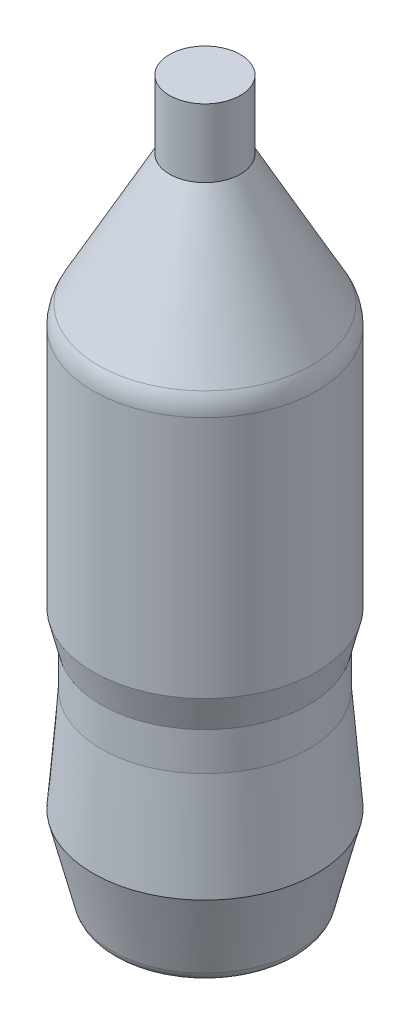
ISO-10303-21;
HEADER;
FILE_DESCRIPTION(('STEP AP214'),'2;1');
FILE_NAME('part.step','',(''),(''),'','','');
FILE_SCHEMA(('AUTOMOTIVE_DESIGN { 1 0 10303 214 1 1 1 1 }'));
ENDSEC;
DATA;
#1=APPLICATION_CONTEXT('core data for automotive mechanical design processes');
#2=APPLICATION_PROTOCOL_DEFINITION('international standard','automotive_design',2000,#1);
#3=PRODUCT_CONTEXT('',#1,'mechanical');
#4=PRODUCT('Part','Part','',(#3));
#5=PRODUCT_RELATED_PRODUCT_CATEGORY('part','',(#4));
#6=PRODUCT_DEFINITION_FORMATION('','',#4);
#7=PRODUCT_DEFINITION_CONTEXT('part definition',#1,'design');
#8=PRODUCT_DEFINITION('design','',#6,#7);
#9=PRODUCT_DEFINITION_SHAPE('','',#8);
#10=(LENGTH_UNIT() NAMED_UNIT(*) SI_UNIT(.MILLI.,.METRE.));
#11=(NAMED_UNIT(*) PLANE_ANGLE_UNIT() SI_UNIT($,.RADIAN.));
#12=(NAMED_UNIT(*) SI_UNIT($,.STERADIAN.) SOLID_ANGLE_UNIT());
#13=UNCERTAINTY_MEASURE_WITH_UNIT(LENGTH_MEASURE(1.E-05),#10,'distance_accuracy_value','');
#14=(GEOMETRIC_REPRESENTATION_CONTEXT(3) GLOBAL_UNCERTAINTY_ASSIGNED_CONTEXT((#13)) GLOBAL_UNIT_ASSIGNED_CONTEXT((#10,
#11,#12)) REPRESENTATION_CONTEXT('',''));
#15=CARTESIAN_POINT('',(0.,0.,0.));
#16=DIRECTION('',(0.,0.,1.));
#17=DIRECTION('',(1.,0.,0.));
#18=AXIS2_PLACEMENT_3D('',#15,#16,#17);
#19=CARTESIAN_POINT('',(0.,265.,0.));
#20=DIRECTION('',(0.,-1.,0.));
#21=DIRECTION('',(0.,0.,-1.));
#22=AXIS2_PLACEMENT_3D('',#19,#20,#21);
#23=CYLINDRICAL_SURFACE('',#22,41.);
#24=CARTESIAN_POINT('',(0.,185.153168126167,0.));
#25=DIRECTION('',(0.,1.,0.));
#26=DIRECTION('',(0.,0.,1.));
#27=AXIS2_PLACEMENT_3D('',#24,#25,#26);
#28=CIRCLE('',#27,41.);
#29=CARTESIAN_POINT('',(0.,185.153168126167,41.));
#30=VERTEX_POINT('',#29);
#31=EDGE_CURVE('E53',#30,#30,#28,.F.);
#32=ORIENTED_EDGE('',*,*,#31,.T.);
#33=EDGE_LOOP('',(#32));
#34=FACE_BOUND('',#33,.T.);
#35=CARTESIAN_POINT('',(0.,96.,0.));
#36=DIRECTION('',(0.,-1.,0.));
#37=DIRECTION('',(0.,0.,-1.));
#38=AXIS2_PLACEMENT_3D('',#35,#36,#37);
#39=CIRCLE('',#38,41.);
#40=CARTESIAN_POINT('',(0.,96.,41.));
#41=VERTEX_POINT('',#40);
#42=EDGE_CURVE('E78',#41,#41,#39,.T.);
#43=ORIENTED_EDGE('',*,*,#42,.F.);
#44=EDGE_LOOP('',(#43));
#45=FACE_BOUND('',#44,.T.);
#46=ADVANCED_FACE('F45',(#34,#45),#23,.T.);
#47=CARTESIAN_POINT('',(0.,240.,0.));
#48=DIRECTION('',(0.,1.,0.));
#49=DIRECTION('',(0.,0.,1.));
#50=AXIS2_PLACEMENT_3D('',#47,#48,#49);
#51=CYLINDRICAL_SURFACE('',#50,13.);
#52=CARTESIAN_POINT('',(0.,240.,0.));
#53=DIRECTION('',(0.,1.,0.));
#54=DIRECTION('',(0.,0.,1.));
#55=AXIS2_PLACEMENT_3D('',#52,#53,#54);
#56=CIRCLE('',#55,13.);
#57=CARTESIAN_POINT('',(0.,240.,-13.));
#58=VERTEX_POINT('',#57);
#59=EDGE_CURVE('E77',#58,#58,#56,.T.);
#60=ORIENTED_EDGE('',*,*,#59,.T.);
#61=EDGE_LOOP('',(#60));
#62=FACE_BOUND('',#61,.T.);
#63=CARTESIAN_POINT('',(0.,265.,0.));
#64=DIRECTION('',(0.,1.,0.));
#65=DIRECTION('',(0.,0.,1.));
#66=AXIS2_PLACEMENT_3D('',#63,#64,#65);
#67=CIRCLE('',#66,13.);
#68=CARTESIAN_POINT('',(0.,265.,13.));
#69=VERTEX_POINT('',#68);
#70=EDGE_CURVE('E82',#69,#69,#67,.T.);
#71=ORIENTED_EDGE('',*,*,#70,.F.);
#72=EDGE_LOOP('',(#71));
#73=FACE_BOUND('',#72,.T.);
#74=ADVANCED_FACE('F94',(#62,#73),#51,.T.);
#75=CARTESIAN_POINT('',(0.,265.,0.));
#76=DIRECTION('',(0.,1.,0.));
#77=DIRECTION('',(0.,0.,1.));
#78=AXIS2_PLACEMENT_3D('',#75,#76,#77);
#79=PLANE('',#78);
#80=ORIENTED_EDGE('',*,*,#70,.T.);
#81=EDGE_LOOP('',(#80));
#82=FACE_BOUND('',#81,.T.);
#83=ADVANCED_FACE('F100',(#82),#79,.T.);
#84=CARTESIAN_POINT('',(0.,240.,0.));
#85=DIRECTION('',(0.,-1.,0.));
#86=DIRECTION('',(0.,0.,-1.));
#87=AXIS2_PLACEMENT_3D('',#84,#85,#86);
#88=CONICAL_SURFACE('',#87,13.,0.502090199021993);
#89=CARTESIAN_POINT('',(0.,192.372050309057,0.));
#90=DIRECTION('',(0.,-1.,0.));
#91=DIRECTION('',(0.,0.,-1.));
#92=AXIS2_PLACEMENT_3D('',#89,#90,#91);
#93=CIRCLE('',#92,39.1486782616939);
#94=CARTESIAN_POINT('',(0.,192.372050309057,-39.1486782616939));
#95=VERTEX_POINT('',#94);
#96=EDGE_CURVE('E11',#95,#95,#93,.F.);
#97=CARTESIAN_POINT('',(0.,192.372050309057,-39.1486782616939));
#98=CARTESIAN_POINT('',(0.,192.868174785005,-38.8762961964679));
#99=CARTESIAN_POINT('',(0.,193.364299260952,-38.603914131242));
#100=CARTESIAN_POINT('',(0.,194.356548212847,-38.05915000079));
#101=CARTESIAN_POINT('',(0.,194.852672688794,-37.786767935564));
#102=CARTESIAN_POINT('',(0.,195.844921640689,-37.2420038051121));
#103=CARTESIAN_POINT('',(0.,196.341046116636,-36.9696217398861));
#104=CARTESIAN_POINT('',(0.,197.333295068531,-36.4248576094341));
#105=CARTESIAN_POINT('',(0.,197.829419544478,-36.1524755442082));
#106=CARTESIAN_POINT('',(0.,198.821668496372,-35.6077114137562));
#107=CARTESIAN_POINT('',(0.,199.31779297232,-35.3353293485302));
#108=CARTESIAN_POINT('',(0.,200.310041924214,-34.7905652180783));
#109=CARTESIAN_POINT('',(0.,200.806166400162,-34.5181831528523));
#110=CARTESIAN_POINT('',(0.,201.798415352056,-33.9734190224003));
#111=CARTESIAN_POINT('',(0.,202.294539828004,-33.7010369571743));
#112=CARTESIAN_POINT('',(0.,203.286788779898,-33.1562728267224));
#113=CARTESIAN_POINT('',(0.,203.782913255846,-32.8838907614964));
#114=CARTESIAN_POINT('',(0.,204.77516220774,-32.3391266310445));
#115=CARTESIAN_POINT('',(0.,205.271286683688,-32.0667445658185));
#116=CARTESIAN_POINT('',(0.,206.263535635582,-31.5219804353665));
#117=CARTESIAN_POINT('',(0.,206.75966011153,-31.2495983701405));
#118=CARTESIAN_POINT('',(0.,207.751909063424,-30.7048342396886));
#119=CARTESIAN_POINT('',(0.,208.248033539372,-30.4324521744626));
#120=CARTESIAN_POINT('',(0.,209.240282491266,-29.8876880440106));
#121=CARTESIAN_POINT('',(0.,209.736406967214,-29.6153059787847));
#122=CARTESIAN_POINT('',(0.,210.728655919108,-29.0705418483327));
#123=CARTESIAN_POINT('',(0.,211.224780395055,-28.7981597831067));
#124=CARTESIAN_POINT('',(0.,212.21702934695,-28.2533956526548));
#125=CARTESIAN_POINT('',(0.,212.713153822897,-27.9810135874288));
#126=CARTESIAN_POINT('',(0.,213.705402774792,-27.4362494569768));
#127=CARTESIAN_POINT('',(0.,214.201527250739,-27.1638673917509));
#128=CARTESIAN_POINT('',(0.,215.193776202634,-26.6191032612989));
#129=CARTESIAN_POINT('',(0.,215.689900678581,-26.3467211960729));
#130=CARTESIAN_POINT('',(0.,216.682149630476,-25.801957065621));
#131=CARTESIAN_POINT('',(0.,217.178274106423,-25.529575000395));
#132=CARTESIAN_POINT('',(0.,218.170523058318,-24.984810869943));
#133=CARTESIAN_POINT('',(0.,218.666647534265,-24.7124288047171));
#134=CARTESIAN_POINT('',(0.,219.65889648616,-24.1676646742651));
#135=CARTESIAN_POINT('',(0.,220.155020962107,-23.8952826090391));
#136=CARTESIAN_POINT('',(0.,221.147269914002,-23.3505184785872));
#137=CARTESIAN_POINT('',(0.,221.643394389949,-23.0781364133612));
#138=CARTESIAN_POINT('',(0.,222.635643341844,-22.5333722829092));
#139=CARTESIAN_POINT('',(0.,223.131767817791,-22.2609902176833));
#140=CARTESIAN_POINT('',(0.,224.124016769686,-21.7162260872313));
#141=CARTESIAN_POINT('',(0.,224.620141245633,-21.4438440220053));
#142=CARTESIAN_POINT('',(0.,225.612390197528,-20.8990798915534));
#143=CARTESIAN_POINT('',(0.,226.108514673475,-20.6266978263274));
#144=CARTESIAN_POINT('',(0.,227.10076362537,-20.0819336958754));
#145=CARTESIAN_POINT('',(0.,227.596888101317,-19.8095516306494));
#146=CARTESIAN_POINT('',(0.,228.589137053212,-19.2647875001975));
#147=CARTESIAN_POINT('',(0.,229.085261529159,-18.9924054349715));
#148=CARTESIAN_POINT('',(0.,230.077510481054,-18.4476413045196));
#149=CARTESIAN_POINT('',(0.,230.573634957001,-18.1752592392936));
#150=CARTESIAN_POINT('',(0.,231.565883908896,-17.6304951088416));
#151=CARTESIAN_POINT('',(0.,232.062008384843,-17.3581130436156));
#152=CARTESIAN_POINT('',(0.,233.054257336738,-16.8133489131637));
#153=CARTESIAN_POINT('',(0.,233.550381812685,-16.5409668479377));
#154=CARTESIAN_POINT('',(0.,234.542630764579,-15.9962027174858));
#155=CARTESIAN_POINT('',(0.,235.038755240527,-15.7238206522598));
#156=CARTESIAN_POINT('',(0.,236.031004192421,-15.1790565218078));
#157=CARTESIAN_POINT('',(0.,236.527128668369,-14.9066744565818));
#158=CARTESIAN_POINT('',(0.,237.519377620263,-14.3619103261299));
#159=CARTESIAN_POINT('',(0.,238.015502096211,-14.0895282609039));
#160=CARTESIAN_POINT('',(0.,239.007751048105,-13.5447641304519));
#161=CARTESIAN_POINT('',(0.,239.503875524053,-13.272382065226));
#162=CARTESIAN_POINT('',(0.,240.,-13.));
#163=B_SPLINE_CURVE_WITH_KNOTS('',3,(#97,#98,#99,#100,#101,#102,#103,#104,#105,#106,#107,#108,
#109,#110,#111,#112,#113,#114,#115,#116,#117,#118,#119,#120,#121,#122,#123,#124,#125,#126,#127,
#128,#129,#130,#131,#132,#133,#134,#135,#136,#137,#138,#139,#140,#141,#142,#143,#144,#145,#146,
#147,#148,#149,#150,#151,#152,#153,#154,#155,#156,#157,#158,#159,#160,#161,#162),.UNSPECIFIED.,
.F.,.F.,(4,2,2,2,2,2,2,2,2,2,2,2,2,2,2,2,2,2,2,2,2,2,2,2,2,2,2,2,2,2,2,2,4),(0.,
1.69793502991633,3.39587005983267,5.09380508974897,6.79174011966528,8.48967514958162,
10.187610179498,11.8855452094143,13.5834802393306,15.2814152692469,16.9793502991632,
18.6772853290795,20.3752203589959,22.0731553889122,23.7710904188285,25.4690254487448,
27.1669604786611,28.8648955085775,30.5628305384938,32.2607655684101,33.9587005983264,
35.6566356282428,37.3545706581591,39.0525056880754,40.7504407179917,42.4483757479081,
44.1463107778244,45.8442458077407,47.542180837657,49.2401158675733,50.9380508974897,
52.635985927406,54.3339209573223),.UNSPECIFIED.);
#164=EDGE_CURVE('BSEAM97',#95,#58,#163,.T.);
#165=ORIENTED_EDGE('',*,*,#96,.T.);
#166=ORIENTED_EDGE('',*,*,#59,.F.);
#167=ORIENTED_EDGE('',*,*,#164,.T.);
#168=ORIENTED_EDGE('',*,*,#164,.F.);
#169=EDGE_LOOP('',(#165,#167,#166,#168));
#170=FACE_BOUND('',#169,.T.);
#171=ADVANCED_FACE('F97',(#170),#88,.T.);
#172=CARTESIAN_POINT('',(0.,96.,0.));
#173=DIRECTION('',(0.,-1.,0.));
#174=DIRECTION('',(0.,0.,-1.));
#175=AXIS2_PLACEMENT_3D('',#172,#173,#174);
#176=CYLINDRICAL_SURFACE('',#175,38.);
#177=CARTESIAN_POINT('',(0.,84.0000000000004,0.));
#178=DIRECTION('',(0.,-1.,0.));
#179=DIRECTION('',(0.,0.,-1.));
#180=AXIS2_PLACEMENT_3D('',#177,#178,#179);
#181=CIRCLE('',#180,38.);
#182=CARTESIAN_POINT('',(0.,84.0000000000004,38.));
#183=VERTEX_POINT('',#182);
#184=EDGE_CURVE('E69',#183,#183,#181,.T.);
#185=ORIENTED_EDGE('',*,*,#184,.T.);
#186=EDGE_LOOP('',(#185));
#187=FACE_BOUND('',#186,.T.);
#188=CARTESIAN_POINT('',(0.,69.9999999999992,0.));
#189=DIRECTION('',(0.,-1.,0.));
#190=DIRECTION('',(0.,0.,-1.));
#191=AXIS2_PLACEMENT_3D('',#188,#189,#190);
#192=CIRCLE('',#191,38.);
#193=CARTESIAN_POINT('',(0.,69.9999999999992,-38.));
#194=VERTEX_POINT('',#193);
#195=EDGE_CURVE('E73',#194,#194,#192,.F.);
#196=ORIENTED_EDGE('',*,*,#195,.T.);
#197=EDGE_LOOP('',(#196));
#198=FACE_BOUND('',#197,.T.);
#199=ADVANCED_FACE('F99',(#187,#198),#176,.T.);
#200=CARTESIAN_POINT('',(0.,0.,0.));
#201=DIRECTION('',(0.,1.,0.));
#202=DIRECTION('',(0.,0.,1.));
#203=AXIS2_PLACEMENT_3D('',#200,#201,#202);
#204=PLANE('',#203);
#205=CARTESIAN_POINT('',(0.,0.,0.));
#206=DIRECTION('',(0.,1.,0.));
#207=DIRECTION('',(0.,0.,1.));
#208=AXIS2_PLACEMENT_3D('',#205,#206,#207);
#209=CIRCLE('',#208,29.0961179679779);
#210=CARTESIAN_POINT('',(0.,0.,29.0961179679779));
#211=VERTEX_POINT('',#210);
#212=EDGE_CURVE('E63',#211,#211,#209,.F.);
#213=ORIENTED_EDGE('',*,*,#212,.T.);
#214=EDGE_LOOP('',(#213));
#215=FACE_BOUND('',#214,.T.);
#216=ADVANCED_FACE('F106',(#215),#204,.F.);
#217=CARTESIAN_POINT('',(0.,32.,0.));
#218=DIRECTION('',(0.,-1.,0.));
#219=DIRECTION('',(0.,0.,-1.));
#220=AXIS2_PLACEMENT_3D('',#217,#218,#219);
#221=CONICAL_SURFACE('',#220,41.0000000000001,0.0787839609891472);
#222=ORIENTED_EDGE('',*,*,#195,.F.);
#223=EDGE_LOOP('',(#222));
#224=FACE_BOUND('',#223,.T.);
#225=CARTESIAN_POINT('',(0.,32.,0.));
#226=DIRECTION('',(0.,-1.,0.));
#227=DIRECTION('',(0.,0.,-1.));
#228=AXIS2_PLACEMENT_3D('',#225,#226,#227);
#229=CIRCLE('',#228,41.);
#230=CARTESIAN_POINT('',(0.,32.,-41.));
#231=VERTEX_POINT('',#230);
#232=EDGE_CURVE('E83',#231,#231,#229,.T.);
#233=ORIENTED_EDGE('',*,*,#232,.F.);
#234=EDGE_LOOP('',(#233));
#235=FACE_BOUND('',#234,.T.);
#236=ADVANCED_FACE('F122',(#224,#235),#221,.T.);
#237=CARTESIAN_POINT('',(0.,84.0000000000004,0.));
#238=DIRECTION('',(0.,1.,0.));
#239=DIRECTION('',(0.,0.,1.));
#240=AXIS2_PLACEMENT_3D('',#237,#238,#239);
#241=CONICAL_SURFACE('',#240,38.,0.244978663126867);
#242=CARTESIAN_POINT('',(0.,96.,41.));
#243=CARTESIAN_POINT('',(0.,95.875,40.96875));
#244=CARTESIAN_POINT('',(0.,95.75,40.9375));
#245=CARTESIAN_POINT('',(0.,95.5,40.875));
#246=CARTESIAN_POINT('',(0.,95.375,40.84375));
#247=CARTESIAN_POINT('',(0.,95.125,40.78125));
#248=CARTESIAN_POINT('',(0.,95.,40.75));
#249=CARTESIAN_POINT('',(0.,94.75,40.6875));
#250=CARTESIAN_POINT('',(0.,94.6250000000001,40.65625));
#251=CARTESIAN_POINT('',(0.,94.3750000000001,40.59375));
#252=CARTESIAN_POINT('',(0.,94.2500000000001,40.5625));
#253=CARTESIAN_POINT('',(0.,94.0000000000001,40.5));
#254=CARTESIAN_POINT('',(0.,93.8750000000001,40.46875));
#255=CARTESIAN_POINT('',(0.,93.6250000000001,40.40625));
#256=CARTESIAN_POINT('',(0.,93.5000000000001,40.375));
#257=CARTESIAN_POINT('',(0.,93.2500000000001,40.3125));
#258=CARTESIAN_POINT('',(0.,93.1250000000001,40.28125));
#259=CARTESIAN_POINT('',(0.,92.8750000000001,40.21875));
#260=CARTESIAN_POINT('',(0.,92.7500000000001,40.1875));
#261=CARTESIAN_POINT('',(0.,92.5000000000001,40.125));
#262=CARTESIAN_POINT('',(0.,92.3750000000001,40.09375));
#263=CARTESIAN_POINT('',(0.,92.1250000000001,40.03125));
#264=CARTESIAN_POINT('',(0.,92.0000000000001,40.));
#265=CARTESIAN_POINT('',(0.,91.7500000000001,39.9375));
#266=CARTESIAN_POINT('',(0.,91.6250000000001,39.90625));
#267=CARTESIAN_POINT('',(0.,91.3750000000001,39.84375));
#268=CARTESIAN_POINT('',(0.,91.2500000000002,39.8125));
#269=CARTESIAN_POINT('',(0.,91.0000000000002,39.75));
#270=CARTESIAN_POINT('',(0.,90.8750000000002,39.71875));
#271=CARTESIAN_POINT('',(0.,90.6250000000002,39.65625));
#272=CARTESIAN_POINT('',(0.,90.5000000000002,39.625));
#273=CARTESIAN_POINT('',(0.,90.2500000000002,39.5625));
#274=CARTESIAN_POINT('',(0.,90.1250000000002,39.53125));
#275=CARTESIAN_POINT('',(0.,89.8750000000002,39.46875));
#276=CARTESIAN_POINT('',(0.,89.7500000000002,39.4375));
#277=CARTESIAN_POINT('',(0.,89.5000000000002,39.375));
#278=CARTESIAN_POINT('',(0.,89.3750000000002,39.34375));
#279=CARTESIAN_POINT('',(0.,89.1250000000002,39.28125));
#280=CARTESIAN_POINT('',(0.,89.0000000000002,39.25));
#281=CARTESIAN_POINT('',(0.,88.7500000000002,39.1875));
#282=CARTESIAN_POINT('',(0.,88.6250000000002,39.15625));
#283=CARTESIAN_POINT('',(0.,88.3750000000002,39.09375));
#284=CARTESIAN_POINT('',(0.,88.2500000000002,39.0625));
#285=CARTESIAN_POINT('',(0.,88.0000000000002,39.));
#286=CARTESIAN_POINT('',(0.,87.8750000000002,38.96875));
#287=CARTESIAN_POINT('',(0.,87.6250000000002,38.90625));
#288=CARTESIAN_POINT('',(0.,87.5000000000003,38.875));
#289=CARTESIAN_POINT('',(0.,87.2500000000003,38.8125));
#290=CARTESIAN_POINT('',(0.,87.1250000000003,38.78125));
#291=CARTESIAN_POINT('',(0.,86.8750000000003,38.71875));
#292=CARTESIAN_POINT('',(0.,86.7500000000003,38.6875));
#293=CARTESIAN_POINT('',(0.,86.5000000000003,38.625));
#294=CARTESIAN_POINT('',(0.,86.3750000000003,38.59375));
#295=CARTESIAN_POINT('',(0.,86.1250000000003,38.53125));
#296=CARTESIAN_POINT('',(0.,86.0000000000003,38.5));
#297=CARTESIAN_POINT('',(0.,85.7500000000003,38.4375));
#298=CARTESIAN_POINT('',(0.,85.6250000000003,38.40625));
#299=CARTESIAN_POINT('',(0.,85.3750000000003,38.34375));
#300=CARTESIAN_POINT('',(0.,85.2500000000003,38.3125));
#301=CARTESIAN_POINT('',(0.,85.0000000000003,38.25));
#302=CARTESIAN_POINT('',(0.,84.8750000000003,38.21875));
#303=CARTESIAN_POINT('',(0.,84.6250000000003,38.15625));
#304=CARTESIAN_POINT('',(0.,84.5000000000004,38.125));
#305=CARTESIAN_POINT('',(0.,84.2500000000004,38.0625));
#306=CARTESIAN_POINT('',(0.,84.1250000000004,38.03125));
#307=CARTESIAN_POINT('',(0.,84.0000000000004,38.));
#308=B_SPLINE_CURVE_WITH_KNOTS('',3,(#242,#243,#244,#245,#246,#247,#248,#249,#250,#251,#252,
#253,#254,#255,#256,#257,#258,#259,#260,#261,#262,#263,#264,#265,#266,#267,#268,#269,#270,#271,
#272,#273,#274,#275,#276,#277,#278,#279,#280,#281,#282,#283,#284,#285,#286,#287,#288,#289,#290,
#291,#292,#293,#294,#295,#296,#297,#298,#299,#300,#301,#302,#303,#304,#305,#306,#307),
.UNSPECIFIED.,.F.,.F.,(4,2,2,2,2,2,2,2,2,2,2,2,2,2,2,2,2,2,2,2,2,2,2,2,2,2,2,2,2,2,2,2,4),(0.,
0.386541152401655,0.773082304803297,1.15962345720494,1.54616460960658,1.93270576200822,
2.31924691440988,2.70578806681152,3.09232921921316,3.47887037161481,3.86541152401645,
4.2519526764181,4.63849382881975,5.02503498122139,5.41157613362303,5.79811728602467,
6.18465843842631,6.57119959082797,6.95774074322961,7.34428189563125,7.73082304803289,
8.11736420043454,8.50390535283619,8.89044650523784,9.27698765763948,9.66352881004112,
10.0500699624428,10.4366111148444,10.8231522672461,11.2096934196477,11.5962345720493,
11.982775724451,12.3693168768526),.UNSPECIFIED.);
#309=EDGE_CURVE('BSEAM127',#41,#183,#308,.T.);
#310=ORIENTED_EDGE('',*,*,#42,.T.);
#311=ORIENTED_EDGE('',*,*,#184,.F.);
#312=ORIENTED_EDGE('',*,*,#309,.T.);
#313=ORIENTED_EDGE('',*,*,#309,.F.);
#314=EDGE_LOOP('',(#310,#312,#311,#313));
#315=FACE_BOUND('',#314,.T.);
#316=ADVANCED_FACE('F127',(#315),#241,.T.);
#317=CARTESIAN_POINT('',(0.,32.0000000000004,0.));
#318=DIRECTION('',(0.,1.,0.));
#319=DIRECTION('',(0.,0.,1.));
#320=AXIS2_PLACEMENT_3D('',#317,#318,#319);
#321=CONICAL_SURFACE('',#320,41.,0.244978663126861);
#322=CARTESIAN_POINT('',(0.,3.78732187481835,0.));
#323=DIRECTION('',(0.,1.,0.));
#324=DIRECTION('',(0.,0.,1.));
#325=AXIS2_PLACEMENT_3D('',#322,#323,#324);
#326=CIRCLE('',#325,33.9468304687046);
#327=CARTESIAN_POINT('',(0.,3.78732187481835,33.9468304687046));
#328=VERTEX_POINT('',#327);
#329=EDGE_CURVE('E58',#328,#328,#326,.T.);
#330=ORIENTED_EDGE('',*,*,#329,.T.);
#331=EDGE_LOOP('',(#330));
#332=FACE_BOUND('',#331,.T.);
#333=ORIENTED_EDGE('',*,*,#232,.T.);
#334=EDGE_LOOP('',(#333));
#335=FACE_BOUND('',#334,.T.);
#336=ADVANCED_FACE('F133',(#332,#335),#321,.T.);
#337=CARTESIAN_POINT('',(0.,5.,0.));
#338=DIRECTION('',(0.,1.,0.));
#339=DIRECTION('',(0.,0.,1.));
#340=AXIS2_PLACEMENT_3D('',#337,#338,#339);
#341=TOROIDAL_SURFACE('',#340,29.0961179679779,5.);
#342=ORIENTED_EDGE('',*,*,#329,.F.);
#343=EDGE_LOOP('',(#342));
#344=FACE_BOUND('',#343,.T.);
#345=ORIENTED_EDGE('',*,*,#212,.F.);
#346=EDGE_LOOP('',(#345));
#347=FACE_BOUND('',#346,.T.);
#348=ADVANCED_FACE('F131',(#344,#347),#341,.T.);
#349=CARTESIAN_POINT('',(0.,185.153168126167,0.));
#350=DIRECTION('',(0.,1.,0.));
#351=DIRECTION('',(0.,0.,1.));
#352=AXIS2_PLACEMENT_3D('',#349,#350,#351);
#353=TOROIDAL_SURFACE('',#352,26.,15.);
#354=ORIENTED_EDGE('',*,*,#96,.F.);
#355=EDGE_LOOP('',(#354));
#356=FACE_BOUND('',#355,.T.);
#357=ORIENTED_EDGE('',*,*,#31,.F.);
#358=EDGE_LOOP('',(#357));
#359=FACE_BOUND('',#358,.T.);
#360=ADVANCED_FACE('F47',(#356,#359),#353,.T.);
#361=CLOSED_SHELL('',(#46,#74,#83,#171,#199,#216,#236,#316,#336,#348,#360));
#362=MANIFOLD_SOLID_BREP('B2',#361);
#363=ADVANCED_BREP_SHAPE_REPRESENTATION('',(#18,#362),#14);
#364=SHAPE_DEFINITION_REPRESENTATION(#9,#363);
ENDSEC;
END-ISO-10303-21;
